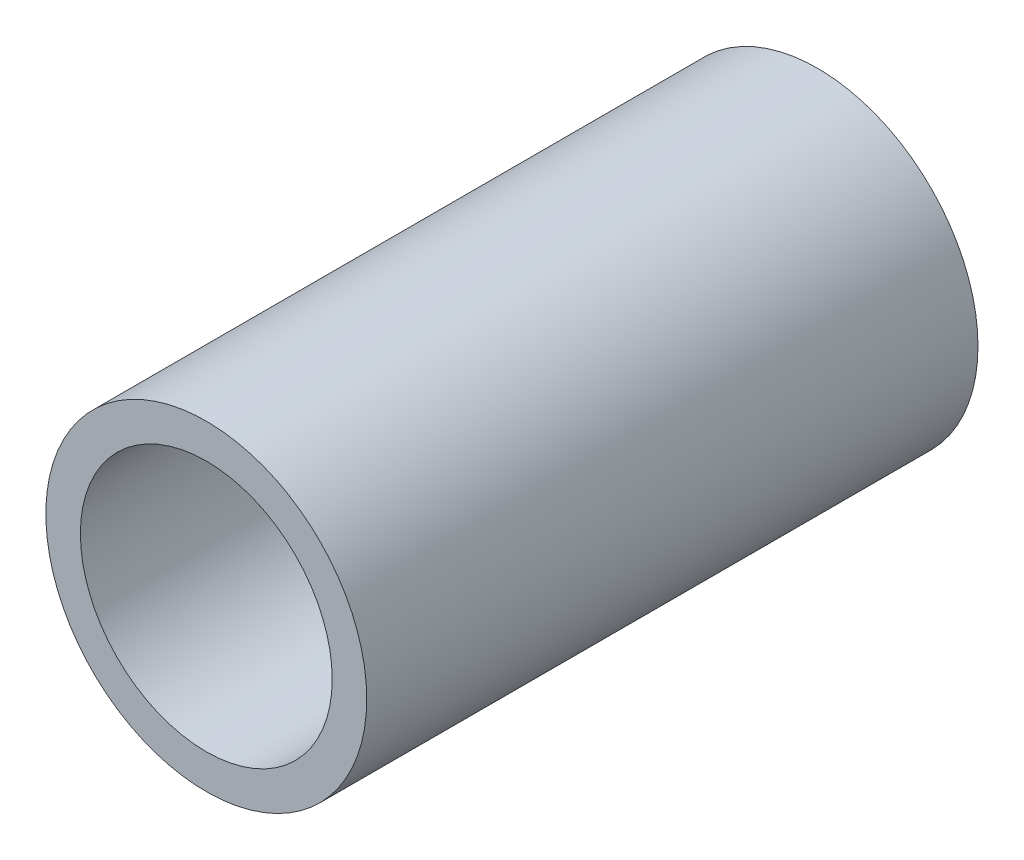
ISO-10303-21;
HEADER;
FILE_DESCRIPTION(('STEP AP214'),'2;1');
FILE_NAME('part.step','',(''),(''),'','','');
FILE_SCHEMA(('AUTOMOTIVE_DESIGN { 1 0 10303 214 1 1 1 1 }'));
ENDSEC;
DATA;
#1=APPLICATION_CONTEXT('core data for automotive mechanical design processes');
#2=APPLICATION_PROTOCOL_DEFINITION('international standard','automotive_design',2000,#1);
#3=PRODUCT_CONTEXT('',#1,'mechanical');
#4=PRODUCT('Part','Part','',(#3));
#5=PRODUCT_RELATED_PRODUCT_CATEGORY('part','',(#4));
#6=PRODUCT_DEFINITION_FORMATION('','',#4);
#7=PRODUCT_DEFINITION_CONTEXT('part definition',#1,'design');
#8=PRODUCT_DEFINITION('design','',#6,#7);
#9=PRODUCT_DEFINITION_SHAPE('','',#8);
#10=(LENGTH_UNIT() NAMED_UNIT(*) SI_UNIT(.MILLI.,.METRE.));
#11=(NAMED_UNIT(*) PLANE_ANGLE_UNIT() SI_UNIT($,.RADIAN.));
#12=(NAMED_UNIT(*) SI_UNIT($,.STERADIAN.) SOLID_ANGLE_UNIT());
#13=UNCERTAINTY_MEASURE_WITH_UNIT(LENGTH_MEASURE(1.E-05),#10,'distance_accuracy_value','');
#14=(GEOMETRIC_REPRESENTATION_CONTEXT(3) GLOBAL_UNCERTAINTY_ASSIGNED_CONTEXT((#13)) GLOBAL_UNIT_ASSIGNED_CONTEXT((#10,
#11,#12)) REPRESENTATION_CONTEXT('',''));
#15=CARTESIAN_POINT('',(0.,0.,0.));
#16=DIRECTION('',(0.,0.,1.));
#17=DIRECTION('',(1.,0.,0.));
#18=AXIS2_PLACEMENT_3D('',#15,#16,#17);
#19=CARTESIAN_POINT('',(0.,0.,50.8));
#20=DIRECTION('',(0.,0.,1.));
#21=DIRECTION('',(1.,0.,0.));
#22=AXIS2_PLACEMENT_3D('',#19,#20,#21);
#23=PLANE('',#22);
#24=CARTESIAN_POINT('',(0.,0.,50.8));
#25=DIRECTION('',(0.,0.,1.));
#26=DIRECTION('',(1.,0.,0.));
#27=AXIS2_PLACEMENT_3D('',#24,#25,#26);
#28=CIRCLE('',#27,13.335);
#29=CARTESIAN_POINT('',(13.335,0.,50.8));
#30=VERTEX_POINT('',#29);
#31=EDGE_CURVE('E10',#30,#30,#28,.T.);
#32=ORIENTED_EDGE('',*,*,#31,.T.);
#33=EDGE_LOOP('',(#32));
#34=FACE_BOUND('',#33,.T.);
#35=CARTESIAN_POINT('',(0.,0.,50.8));
#36=DIRECTION('',(0.,0.,1.));
#37=DIRECTION('',(1.,0.,0.));
#38=AXIS2_PLACEMENT_3D('',#35,#36,#37);
#39=CIRCLE('',#38,10.4648);
#40=CARTESIAN_POINT('',(10.4648,0.,50.8));
#41=VERTEX_POINT('',#40);
#42=EDGE_CURVE('E46',#41,#41,#39,.T.);
#43=ORIENTED_EDGE('',*,*,#42,.F.);
#44=EDGE_LOOP('',(#43));
#45=FACE_BOUND('',#44,.T.);
#46=ADVANCED_FACE('F35',(#34,#45),#23,.T.);
#47=CARTESIAN_POINT('',(0.,0.,0.));
#48=DIRECTION('',(0.,0.,1.));
#49=DIRECTION('',(1.,0.,0.));
#50=AXIS2_PLACEMENT_3D('',#47,#48,#49);
#51=PLANE('',#50);
#52=CARTESIAN_POINT('',(0.,0.,0.));
#53=DIRECTION('',(0.,0.,1.));
#54=DIRECTION('',(1.,0.,0.));
#55=AXIS2_PLACEMENT_3D('',#52,#53,#54);
#56=CIRCLE('',#55,13.335);
#57=CARTESIAN_POINT('',(13.335,0.,0.));
#58=VERTEX_POINT('',#57);
#59=EDGE_CURVE('E39',#58,#58,#56,.T.);
#60=ORIENTED_EDGE('',*,*,#59,.F.);
#61=EDGE_LOOP('',(#60));
#62=FACE_BOUND('',#61,.T.);
#63=CARTESIAN_POINT('',(0.,0.,0.));
#64=DIRECTION('',(0.,0.,1.));
#65=DIRECTION('',(1.,0.,0.));
#66=AXIS2_PLACEMENT_3D('',#63,#64,#65);
#67=CIRCLE('',#66,10.4648);
#68=CARTESIAN_POINT('',(10.4648,0.,0.));
#69=VERTEX_POINT('',#68);
#70=EDGE_CURVE('E48',#69,#69,#67,.T.);
#71=ORIENTED_EDGE('',*,*,#70,.T.);
#72=EDGE_LOOP('',(#71));
#73=FACE_BOUND('',#72,.T.);
#74=ADVANCED_FACE('F58',(#62,#73),#51,.F.);
#75=CARTESIAN_POINT('',(0.,0.,50.8));
#76=DIRECTION('',(0.,0.,-1.));
#77=DIRECTION('',(-1.,0.,0.));
#78=AXIS2_PLACEMENT_3D('',#75,#76,#77);
#79=CYLINDRICAL_SURFACE('',#78,13.335);
#80=ORIENTED_EDGE('',*,*,#31,.F.);
#81=EDGE_LOOP('',(#80));
#82=FACE_BOUND('',#81,.T.);
#83=ORIENTED_EDGE('',*,*,#59,.T.);
#84=EDGE_LOOP('',(#83));
#85=FACE_BOUND('',#84,.T.);
#86=ADVANCED_FACE('F37',(#82,#85),#79,.T.);
#87=CARTESIAN_POINT('',(0.,0.,50.8));
#88=DIRECTION('',(0.,0.,-1.));
#89=DIRECTION('',(-1.,0.,0.));
#90=AXIS2_PLACEMENT_3D('',#87,#88,#89);
#91=CYLINDRICAL_SURFACE('',#90,10.4648);
#92=ORIENTED_EDGE('',*,*,#42,.T.);
#93=EDGE_LOOP('',(#92));
#94=FACE_BOUND('',#93,.T.);
#95=ORIENTED_EDGE('',*,*,#70,.F.);
#96=EDGE_LOOP('',(#95));
#97=FACE_BOUND('',#96,.T.);
#98=ADVANCED_FACE('F54',(#94,#97),#91,.F.);
#99=CLOSED_SHELL('',(#46,#74,#86,#98));
#100=MANIFOLD_SOLID_BREP('B2',#99);
#101=ADVANCED_BREP_SHAPE_REPRESENTATION('',(#18,#100),#14);
#102=SHAPE_DEFINITION_REPRESENTATION(#9,#101);
ENDSEC;
END-ISO-10303-21;
